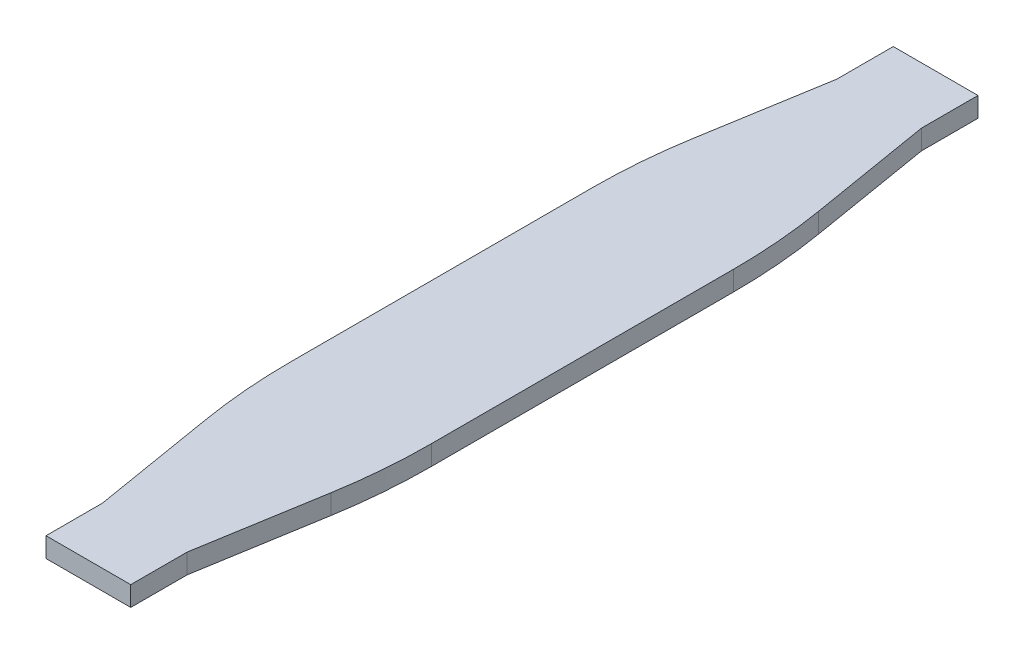
ISO-10303-21;
HEADER;
FILE_DESCRIPTION(('STEP AP214'),'2;1');
FILE_NAME('part.step','',(''),(''),'','','');
FILE_SCHEMA(('AUTOMOTIVE_DESIGN { 1 0 10303 214 1 1 1 1 }'));
ENDSEC;
DATA;
#1=APPLICATION_CONTEXT('core data for automotive mechanical design processes');
#2=APPLICATION_PROTOCOL_DEFINITION('international standard','automotive_design',2000,#1);
#3=PRODUCT_CONTEXT('',#1,'mechanical');
#4=PRODUCT('Part','Part','',(#3));
#5=PRODUCT_RELATED_PRODUCT_CATEGORY('part','',(#4));
#6=PRODUCT_DEFINITION_FORMATION('','',#4);
#7=PRODUCT_DEFINITION_CONTEXT('part definition',#1,'design');
#8=PRODUCT_DEFINITION('design','',#6,#7);
#9=PRODUCT_DEFINITION_SHAPE('','',#8);
#10=(LENGTH_UNIT() NAMED_UNIT(*) SI_UNIT(.MILLI.,.METRE.));
#11=(NAMED_UNIT(*) PLANE_ANGLE_UNIT() SI_UNIT($,.RADIAN.));
#12=(NAMED_UNIT(*) SI_UNIT($,.STERADIAN.) SOLID_ANGLE_UNIT());
#13=UNCERTAINTY_MEASURE_WITH_UNIT(LENGTH_MEASURE(1.E-05),#10,'distance_accuracy_value','');
#14=(GEOMETRIC_REPRESENTATION_CONTEXT(3) GLOBAL_UNCERTAINTY_ASSIGNED_CONTEXT((#13)) GLOBAL_UNIT_ASSIGNED_CONTEXT((#10,
#11,#12)) REPRESENTATION_CONTEXT('',''));
#15=CARTESIAN_POINT('',(0.,0.,0.));
#16=DIRECTION('',(0.,0.,1.));
#17=DIRECTION('',(1.,0.,0.));
#18=AXIS2_PLACEMENT_3D('',#15,#16,#17);
#19=CARTESIAN_POINT('',(66.4571890003025,0.35,-139.493591924394));
#20=DIRECTION('',(-1.,0.,0.));
#21=DIRECTION('',(0.,0.,1.));
#22=AXIS2_PLACEMENT_3D('',#19,#20,#21);
#23=PLANE('',#22);
#24=DIRECTION('',(0.,0.,-1.));
#25=VECTOR('',#24,1.);
#26=CARTESIAN_POINT('',(66.4571890003025,0.,-139.493591924394));
#27=LINE('',#26,#25);
#28=CARTESIAN_POINT('',(66.4571890003025,0.,-133.321217227377));
#29=VERTEX_POINT('',#28);
#30=CARTESIAN_POINT('',(66.4571890003025,0.,-138.665966621412));
#31=VERTEX_POINT('',#30);
#32=EDGE_CURVE('E229',#29,#31,#27,.T.);
#33=ORIENTED_EDGE('',*,*,#32,.T.);
#34=DIRECTION('',(0.,-1.,0.));
#35=VECTOR('',#34,1.);
#36=CARTESIAN_POINT('',(66.4571890003025,0.35,-138.665966621412));
#37=LINE('',#36,#35);
#38=CARTESIAN_POINT('',(66.4571890003025,0.35,-138.665966621412));
#39=VERTEX_POINT('',#38);
#40=EDGE_CURVE('E305',#31,#39,#37,.F.);
#41=ORIENTED_EDGE('',*,*,#40,.T.);
#42=DIRECTION('',(0.,0.,-1.));
#43=VECTOR('',#42,1.);
#44=CARTESIAN_POINT('',(66.4571890003025,0.35,-139.493591924394));
#45=LINE('',#44,#43);
#46=CARTESIAN_POINT('',(66.4571890003025,0.35,-133.321217227377));
#47=VERTEX_POINT('',#46);
#48=EDGE_CURVE('E185',#47,#39,#45,.T.);
#49=ORIENTED_EDGE('',*,*,#48,.F.);
#50=DIRECTION('',(0.,-1.,0.));
#51=VECTOR('',#50,1.);
#52=CARTESIAN_POINT('',(66.4571890003025,0.35,-133.321217227377));
#53=LINE('',#52,#51);
#54=EDGE_CURVE('E301',#47,#29,#53,.T.);
#55=ORIENTED_EDGE('',*,*,#54,.T.);
#56=EDGE_LOOP('',(#33,#41,#49,#55));
#57=FACE_BOUND('',#56,.T.);
#58=ADVANCED_FACE('F38',(#57),#23,.F.);
#59=CARTESIAN_POINT('',(65.9571890003025,0.35,-142.493591924394));
#60=DIRECTION('',(-0.986393923832144,0.,0.164398987305357));
#61=DIRECTION('',(0.164398987305357,0.,0.986393923832144));
#62=AXIS2_PLACEMENT_3D('',#59,#60,#61);
#63=PLANE('',#62);
#64=DIRECTION('',(-0.164398987305357,0.,-0.986393923832144));
#65=VECTOR('',#64,1.);
#66=CARTESIAN_POINT('',(65.9571890003025,0.35,-142.493591924394));
#67=LINE('',#66,#65);
#68=CARTESIAN_POINT('',(66.321128238624,0.35,-140.309956494466));
#69=VERTEX_POINT('',#68);
#70=CARTESIAN_POINT('',(65.9571890003025,0.35,-142.493591924394));
#71=VERTEX_POINT('',#70);
#72=EDGE_CURVE('E172',#69,#71,#67,.T.);
#73=ORIENTED_EDGE('',*,*,#72,.F.);
#74=DIRECTION('',(0.,-1.,0.));
#75=VECTOR('',#74,1.);
#76=CARTESIAN_POINT('',(66.321128238624,0.35,-140.309956494466));
#77=LINE('',#76,#75);
#78=CARTESIAN_POINT('',(66.321128238624,0.,-140.309956494466));
#79=VERTEX_POINT('',#78);
#80=EDGE_CURVE('E195',#69,#79,#77,.T.);
#81=ORIENTED_EDGE('',*,*,#80,.T.);
#82=DIRECTION('',(-0.164398987305357,0.,-0.986393923832144));
#83=VECTOR('',#82,1.);
#84=CARTESIAN_POINT('',(65.9571890003025,0.,-142.493591924394));
#85=LINE('',#84,#83);
#86=CARTESIAN_POINT('',(65.9571890003025,0.,-142.493591924394));
#87=VERTEX_POINT('',#86);
#88=EDGE_CURVE('E191',#79,#87,#85,.T.);
#89=ORIENTED_EDGE('',*,*,#88,.T.);
#90=DIRECTION('',(0.,-1.,0.));
#91=VECTOR('',#90,1.);
#92=CARTESIAN_POINT('',(65.9571890003025,0.35,-142.493591924394));
#93=LINE('',#92,#91);
#94=EDGE_CURVE('E188',#71,#87,#93,.T.);
#95=ORIENTED_EDGE('',*,*,#94,.F.);
#96=EDGE_LOOP('',(#73,#81,#89,#95));
#97=FACE_BOUND('',#96,.T.);
#98=ADVANCED_FACE('F189',(#97),#63,.F.);
#99=CARTESIAN_POINT('',(65.9571890003025,0.35,-143.493591924394));
#100=DIRECTION('',(-1.,0.,0.));
#101=DIRECTION('',(0.,0.,1.));
#102=AXIS2_PLACEMENT_3D('',#99,#100,#101);
#103=PLANE('',#102);
#104=DIRECTION('',(0.,0.,-1.));
#105=VECTOR('',#104,1.);
#106=CARTESIAN_POINT('',(65.9571890003025,0.,-143.493591924394));
#107=LINE('',#106,#105);
#108=CARTESIAN_POINT('',(65.9571890003025,0.,-143.493591924394));
#109=VERTEX_POINT('',#108);
#110=EDGE_CURVE('E235',#87,#109,#107,.T.);
#111=ORIENTED_EDGE('',*,*,#110,.T.);
#112=DIRECTION('',(0.,-1.,0.));
#113=VECTOR('',#112,1.);
#114=CARTESIAN_POINT('',(65.9571890003025,0.35,-143.493591924394));
#115=LINE('',#114,#113);
#116=CARTESIAN_POINT('',(65.9571890003025,0.35,-143.493591924394));
#117=VERTEX_POINT('',#116);
#118=EDGE_CURVE('E196',#117,#109,#115,.T.);
#119=ORIENTED_EDGE('',*,*,#118,.F.);
#120=DIRECTION('',(0.,0.,-1.));
#121=VECTOR('',#120,1.);
#122=CARTESIAN_POINT('',(65.9571890003025,0.35,-143.493591924394));
#123=LINE('',#122,#121);
#124=EDGE_CURVE('E177',#71,#117,#123,.T.);
#125=ORIENTED_EDGE('',*,*,#124,.F.);
#126=ORIENTED_EDGE('',*,*,#94,.T.);
#127=EDGE_LOOP('',(#111,#119,#125,#126));
#128=FACE_BOUND('',#127,.T.);
#129=ADVANCED_FACE('F198',(#128),#103,.F.);
#130=CARTESIAN_POINT('',(64.4571890003025,0.35,-143.493591924394));
#131=DIRECTION('',(0.,0.,1.));
#132=DIRECTION('',(1.,0.,0.));
#133=AXIS2_PLACEMENT_3D('',#130,#131,#132);
#134=PLANE('',#133);
#135=DIRECTION('',(-1.,0.,0.));
#136=VECTOR('',#135,1.);
#137=CARTESIAN_POINT('',(64.4571890003025,0.,-143.493591924394));
#138=LINE('',#137,#136);
#139=CARTESIAN_POINT('',(64.4571890003025,0.,-143.493591924394));
#140=VERTEX_POINT('',#139);
#141=EDGE_CURVE('E238',#109,#140,#138,.T.);
#142=ORIENTED_EDGE('',*,*,#141,.T.);
#143=DIRECTION('',(0.,-1.,0.));
#144=VECTOR('',#143,1.);
#145=CARTESIAN_POINT('',(64.4571890003025,0.35,-143.493591924394));
#146=LINE('',#145,#144);
#147=CARTESIAN_POINT('',(64.4571890003025,0.35,-143.493591924394));
#148=VERTEX_POINT('',#147);
#149=EDGE_CURVE('E282',#148,#140,#146,.T.);
#150=ORIENTED_EDGE('',*,*,#149,.F.);
#151=DIRECTION('',(-1.,0.,0.));
#152=VECTOR('',#151,1.);
#153=CARTESIAN_POINT('',(64.4571890003025,0.35,-143.493591924394));
#154=LINE('',#153,#152);
#155=EDGE_CURVE('E202',#117,#148,#154,.T.);
#156=ORIENTED_EDGE('',*,*,#155,.F.);
#157=ORIENTED_EDGE('',*,*,#118,.T.);
#158=EDGE_LOOP('',(#142,#150,#156,#157));
#159=FACE_BOUND('',#158,.T.);
#160=ADVANCED_FACE('F404',(#159),#134,.F.);
#161=CARTESIAN_POINT('',(64.4571890003025,0.35,-142.493591924394));
#162=DIRECTION('',(1.,0.,0.));
#163=DIRECTION('',(0.,0.,-1.));
#164=AXIS2_PLACEMENT_3D('',#161,#162,#163);
#165=PLANE('',#164);
#166=DIRECTION('',(0.,0.,1.));
#167=VECTOR('',#166,1.);
#168=CARTESIAN_POINT('',(64.4571890003025,0.,-142.493591924394));
#169=LINE('',#168,#167);
#170=CARTESIAN_POINT('',(64.4571890003025,0.,-142.493591924394));
#171=VERTEX_POINT('',#170);
#172=EDGE_CURVE('E241',#140,#171,#169,.T.);
#173=ORIENTED_EDGE('',*,*,#172,.T.);
#174=DIRECTION('',(0.,-1.,0.));
#175=VECTOR('',#174,1.);
#176=CARTESIAN_POINT('',(64.4571890003025,0.35,-142.493591924394));
#177=LINE('',#176,#175);
#178=CARTESIAN_POINT('',(64.4571890003025,0.35,-142.493591924394));
#179=VERTEX_POINT('',#178);
#180=EDGE_CURVE('E278',#179,#171,#177,.T.);
#181=ORIENTED_EDGE('',*,*,#180,.F.);
#182=DIRECTION('',(0.,0.,1.));
#183=VECTOR('',#182,1.);
#184=CARTESIAN_POINT('',(64.4571890003025,0.35,-142.493591924394));
#185=LINE('',#184,#183);
#186=EDGE_CURVE('E206',#148,#179,#185,.T.);
#187=ORIENTED_EDGE('',*,*,#186,.F.);
#188=ORIENTED_EDGE('',*,*,#149,.T.);
#189=EDGE_LOOP('',(#173,#181,#187,#188));
#190=FACE_BOUND('',#189,.T.);
#191=ADVANCED_FACE('F400',(#190),#165,.F.);
#192=CARTESIAN_POINT('',(63.9571890003025,0.35,-139.493591924394));
#193=DIRECTION('',(0.986393923832144,0.,0.164398987305357));
#194=DIRECTION('',(0.164398987305357,0.,-0.986393923832144));
#195=AXIS2_PLACEMENT_3D('',#192,#193,#194);
#196=PLANE('',#195);
#197=DIRECTION('',(-0.164398987305357,0.,0.986393923832144));
#198=VECTOR('',#197,1.);
#199=CARTESIAN_POINT('',(63.9571890003025,0.,-139.493591924394));
#200=LINE('',#199,#198);
#201=CARTESIAN_POINT('',(64.0932497619811,0.,-140.309956494466));
#202=VERTEX_POINT('',#201);
#203=EDGE_CURVE('E244',#171,#202,#200,.T.);
#204=ORIENTED_EDGE('',*,*,#203,.T.);
#205=DIRECTION('',(0.,-1.,0.));
#206=VECTOR('',#205,1.);
#207=CARTESIAN_POINT('',(64.0932497619811,0.35,-140.309956494466));
#208=LINE('',#207,#206);
#209=CARTESIAN_POINT('',(64.0932497619811,0.35,-140.309956494466));
#210=VERTEX_POINT('',#209);
#211=EDGE_CURVE('E11',#202,#210,#208,.F.);
#212=ORIENTED_EDGE('',*,*,#211,.T.);
#213=DIRECTION('',(-0.164398987305357,0.,0.986393923832144));
#214=VECTOR('',#213,1.);
#215=CARTESIAN_POINT('',(63.9571890003025,0.35,-139.493591924394));
#216=LINE('',#215,#214);
#217=EDGE_CURVE('E212',#179,#210,#216,.T.);
#218=ORIENTED_EDGE('',*,*,#217,.F.);
#219=ORIENTED_EDGE('',*,*,#180,.T.);
#220=EDGE_LOOP('',(#204,#212,#218,#219));
#221=FACE_BOUND('',#220,.T.);
#222=ADVANCED_FACE('F395',(#221),#196,.F.);
#223=CARTESIAN_POINT('',(63.9571890003025,0.35,-132.493591924394));
#224=DIRECTION('',(1.,0.,0.));
#225=DIRECTION('',(0.,0.,-1.));
#226=AXIS2_PLACEMENT_3D('',#223,#224,#225);
#227=PLANE('',#226);
#228=DIRECTION('',(0.,0.,1.));
#229=VECTOR('',#228,1.);
#230=CARTESIAN_POINT('',(63.9571890003025,0.,-132.493591924394));
#231=LINE('',#230,#229);
#232=CARTESIAN_POINT('',(63.9571890003025,0.,-138.665966621412));
#233=VERTEX_POINT('',#232);
#234=CARTESIAN_POINT('',(63.9571890003025,0.,-133.321217227377));
#235=VERTEX_POINT('',#234);
#236=EDGE_CURVE('E248',#233,#235,#231,.T.);
#237=ORIENTED_EDGE('',*,*,#236,.T.);
#238=DIRECTION('',(0.,-1.,0.));
#239=VECTOR('',#238,1.);
#240=CARTESIAN_POINT('',(63.9571890003025,0.35,-133.321217227377));
#241=LINE('',#240,#239);
#242=CARTESIAN_POINT('',(63.9571890003025,0.35,-133.321217227377));
#243=VERTEX_POINT('',#242);
#244=EDGE_CURVE('E47',#235,#243,#241,.F.);
#245=ORIENTED_EDGE('',*,*,#244,.T.);
#246=DIRECTION('',(0.,0.,1.));
#247=VECTOR('',#246,1.);
#248=CARTESIAN_POINT('',(63.9571890003025,0.35,-132.493591924394));
#249=LINE('',#248,#247);
#250=CARTESIAN_POINT('',(63.9571890003025,0.35,-138.665966621412));
#251=VERTEX_POINT('',#250);
#252=EDGE_CURVE('E215',#251,#243,#249,.T.);
#253=ORIENTED_EDGE('',*,*,#252,.F.);
#254=DIRECTION('',(0.,-1.,0.));
#255=VECTOR('',#254,1.);
#256=CARTESIAN_POINT('',(63.9571890003025,0.35,-138.665966621412));
#257=LINE('',#256,#255);
#258=EDGE_CURVE('E322',#251,#233,#257,.T.);
#259=ORIENTED_EDGE('',*,*,#258,.T.);
#260=EDGE_LOOP('',(#237,#245,#253,#259));
#261=FACE_BOUND('',#260,.T.);
#262=ADVANCED_FACE('F329',(#261),#227,.F.);
#263=CARTESIAN_POINT('',(63.9571890003025,0.35,-132.493591924394));
#264=DIRECTION('',(0.986393923832144,0.,-0.164398987305357));
#265=DIRECTION('',(-0.164398987305357,0.,-0.986393923832144));
#266=AXIS2_PLACEMENT_3D('',#263,#264,#265);
#267=PLANE('',#266);
#268=DIRECTION('',(0.164398987305357,0.,0.986393923832144));
#269=VECTOR('',#268,1.);
#270=CARTESIAN_POINT('',(63.9571890003025,0.35,-132.493591924394));
#271=LINE('',#270,#269);
#272=CARTESIAN_POINT('',(64.0932497619811,0.35,-131.677227354323));
#273=VERTEX_POINT('',#272);
#274=CARTESIAN_POINT('',(64.4571890003025,0.35,-129.493591924394));
#275=VERTEX_POINT('',#274);
#276=EDGE_CURVE('E217',#273,#275,#271,.T.);
#277=ORIENTED_EDGE('',*,*,#276,.F.);
#278=DIRECTION('',(0.,-1.,0.));
#279=VECTOR('',#278,1.);
#280=CARTESIAN_POINT('',(64.0932497619811,0.35,-131.677227354323));
#281=LINE('',#280,#279);
#282=CARTESIAN_POINT('',(64.0932497619811,0.,-131.677227354323));
#283=VERTEX_POINT('',#282);
#284=EDGE_CURVE('E318',#273,#283,#281,.T.);
#285=ORIENTED_EDGE('',*,*,#284,.T.);
#286=DIRECTION('',(0.164398987305357,0.,0.986393923832144));
#287=VECTOR('',#286,1.);
#288=CARTESIAN_POINT('',(63.9571890003025,0.,-132.493591924394));
#289=LINE('',#288,#287);
#290=CARTESIAN_POINT('',(64.4571890003025,0.,-129.493591924394));
#291=VERTEX_POINT('',#290);
#292=EDGE_CURVE('E252',#283,#291,#289,.T.);
#293=ORIENTED_EDGE('',*,*,#292,.T.);
#294=DIRECTION('',(0.,-1.,0.));
#295=VECTOR('',#294,1.);
#296=CARTESIAN_POINT('',(64.4571890003025,0.35,-129.493591924394));
#297=LINE('',#296,#295);
#298=EDGE_CURVE('E274',#275,#291,#297,.T.);
#299=ORIENTED_EDGE('',*,*,#298,.F.);
#300=EDGE_LOOP('',(#277,#285,#293,#299));
#301=FACE_BOUND('',#300,.T.);
#302=ADVANCED_FACE('F338',(#301),#267,.F.);
#303=CARTESIAN_POINT('',(64.4571890003025,0.35,-129.493591924394));
#304=DIRECTION('',(1.,0.,0.));
#305=DIRECTION('',(0.,0.,-1.));
#306=AXIS2_PLACEMENT_3D('',#303,#304,#305);
#307=PLANE('',#306);
#308=DIRECTION('',(0.,0.,1.));
#309=VECTOR('',#308,1.);
#310=CARTESIAN_POINT('',(64.4571890003025,0.,-129.493591924394));
#311=LINE('',#310,#309);
#312=CARTESIAN_POINT('',(64.4571890003025,0.,-128.493591924394));
#313=VERTEX_POINT('',#312);
#314=EDGE_CURVE('E255',#291,#313,#311,.T.);
#315=ORIENTED_EDGE('',*,*,#314,.T.);
#316=DIRECTION('',(0.,-1.,0.));
#317=VECTOR('',#316,1.);
#318=CARTESIAN_POINT('',(64.4571890003025,0.35,-128.493591924394));
#319=LINE('',#318,#317);
#320=CARTESIAN_POINT('',(64.4571890003025,0.35,-128.493591924394));
#321=VERTEX_POINT('',#320);
#322=EDGE_CURVE('E271',#321,#313,#319,.T.);
#323=ORIENTED_EDGE('',*,*,#322,.F.);
#324=DIRECTION('',(0.,0.,1.));
#325=VECTOR('',#324,1.);
#326=CARTESIAN_POINT('',(64.4571890003025,0.35,-129.493591924394));
#327=LINE('',#326,#325);
#328=EDGE_CURVE('E219',#275,#321,#327,.T.);
#329=ORIENTED_EDGE('',*,*,#328,.F.);
#330=ORIENTED_EDGE('',*,*,#298,.T.);
#331=EDGE_LOOP('',(#315,#323,#329,#330));
#332=FACE_BOUND('',#331,.T.);
#333=ADVANCED_FACE('F346',(#332),#307,.F.);
#334=CARTESIAN_POINT('',(65.2071890003025,0.35,-128.493591924394));
#335=DIRECTION('',(0.,0.,-1.));
#336=DIRECTION('',(-1.,0.,0.));
#337=AXIS2_PLACEMENT_3D('',#334,#335,#336);
#338=PLANE('',#337);
#339=DIRECTION('',(1.,0.,0.));
#340=VECTOR('',#339,1.);
#341=CARTESIAN_POINT('',(65.2071890003025,0.,-128.493591924394));
#342=LINE('',#341,#340);
#343=CARTESIAN_POINT('',(65.9571890003025,0.,-128.493591924394));
#344=VERTEX_POINT('',#343);
#345=EDGE_CURVE('E259',#313,#344,#342,.T.);
#346=ORIENTED_EDGE('',*,*,#345,.T.);
#347=DIRECTION('',(0.,-1.,0.));
#348=VECTOR('',#347,1.);
#349=CARTESIAN_POINT('',(65.9571890003025,0.35,-128.493591924394));
#350=LINE('',#349,#348);
#351=CARTESIAN_POINT('',(65.9571890003025,0.35,-128.493591924394));
#352=VERTEX_POINT('',#351);
#353=EDGE_CURVE('E268',#352,#344,#350,.T.);
#354=ORIENTED_EDGE('',*,*,#353,.F.);
#355=DIRECTION('',(1.,0.,0.));
#356=VECTOR('',#355,1.);
#357=CARTESIAN_POINT('',(64.4571890003025,0.35,-128.493591924394));
#358=LINE('',#357,#356);
#359=EDGE_CURVE('E221',#321,#352,#358,.T.);
#360=ORIENTED_EDGE('',*,*,#359,.F.);
#361=ORIENTED_EDGE('',*,*,#322,.T.);
#362=EDGE_LOOP('',(#346,#354,#360,#361));
#363=FACE_BOUND('',#362,.T.);
#364=ADVANCED_FACE('F350',(#363),#338,.F.);
#365=CARTESIAN_POINT('',(65.9571890003025,0.35,-128.493591924394));
#366=DIRECTION('',(-1.,0.,0.));
#367=DIRECTION('',(0.,0.,1.));
#368=AXIS2_PLACEMENT_3D('',#365,#366,#367);
#369=PLANE('',#368);
#370=DIRECTION('',(0.,0.,-1.));
#371=VECTOR('',#370,1.);
#372=CARTESIAN_POINT('',(65.9571890003025,0.,-128.493591924394));
#373=LINE('',#372,#371);
#374=CARTESIAN_POINT('',(65.9571890003026,0.,-129.493591924394));
#375=VERTEX_POINT('',#374);
#376=EDGE_CURVE('E261',#344,#375,#373,.T.);
#377=ORIENTED_EDGE('',*,*,#376,.T.);
#378=DIRECTION('',(0.,-1.,0.));
#379=VECTOR('',#378,1.);
#380=CARTESIAN_POINT('',(65.9571890003026,0.35,-129.493591924394));
#381=LINE('',#380,#379);
#382=CARTESIAN_POINT('',(65.9571890003026,0.35,-129.493591924394));
#383=VERTEX_POINT('',#382);
#384=EDGE_CURVE('E228',#383,#375,#381,.T.);
#385=ORIENTED_EDGE('',*,*,#384,.F.);
#386=DIRECTION('',(0.,0.,-1.));
#387=VECTOR('',#386,1.);
#388=CARTESIAN_POINT('',(65.9571890003025,0.35,-128.493591924394));
#389=LINE('',#388,#387);
#390=EDGE_CURVE('E223',#352,#383,#389,.T.);
#391=ORIENTED_EDGE('',*,*,#390,.F.);
#392=ORIENTED_EDGE('',*,*,#353,.T.);
#393=EDGE_LOOP('',(#377,#385,#391,#392));
#394=FACE_BOUND('',#393,.T.);
#395=ADVANCED_FACE('F356',(#394),#369,.F.);
#396=CARTESIAN_POINT('',(65.9571890003026,0.35,-129.493591924394));
#397=DIRECTION('',(-0.986393923832144,0.,-0.164398987305353));
#398=DIRECTION('',(-0.164398987305353,0.,0.986393923832145));
#399=AXIS2_PLACEMENT_3D('',#396,#397,#398);
#400=PLANE('',#399);
#401=DIRECTION('',(0.164398987305353,0.,-0.986393923832145));
#402=VECTOR('',#401,1.);
#403=CARTESIAN_POINT('',(65.9571890003026,0.,-129.493591924394));
#404=LINE('',#403,#402);
#405=CARTESIAN_POINT('',(66.321128238624,0.,-131.677227354323));
#406=VERTEX_POINT('',#405);
#407=EDGE_CURVE('E263',#375,#406,#404,.T.);
#408=ORIENTED_EDGE('',*,*,#407,.T.);
#409=DIRECTION('',(0.,-1.,0.));
#410=VECTOR('',#409,1.);
#411=CARTESIAN_POINT('',(66.321128238624,0.35,-131.677227354323));
#412=LINE('',#411,#410);
#413=CARTESIAN_POINT('',(66.321128238624,0.35,-131.677227354323));
#414=VERTEX_POINT('',#413);
#415=EDGE_CURVE('E57',#406,#414,#412,.F.);
#416=ORIENTED_EDGE('',*,*,#415,.T.);
#417=DIRECTION('',(0.164398987305353,0.,-0.986393923832145));
#418=VECTOR('',#417,1.);
#419=CARTESIAN_POINT('',(65.9571890003026,0.35,-129.493591924394));
#420=LINE('',#419,#418);
#421=EDGE_CURVE('E225',#383,#414,#420,.T.);
#422=ORIENTED_EDGE('',*,*,#421,.F.);
#423=ORIENTED_EDGE('',*,*,#384,.T.);
#424=EDGE_LOOP('',(#408,#416,#422,#423));
#425=FACE_BOUND('',#424,.T.);
#426=ADVANCED_FACE('F358',(#425),#400,.F.);
#427=CARTESIAN_POINT('',(0.,0.35,0.));
#428=DIRECTION('',(0.,1.,0.));
#429=DIRECTION('',(0.,0.,1.));
#430=AXIS2_PLACEMENT_3D('',#427,#428,#429);
#431=PLANE('',#430);
#432=ORIENTED_EDGE('',*,*,#48,.T.);
#433=CARTESIAN_POINT('',(56.4571890003025,0.35,-138.665966621412));
#434=DIRECTION('',(0.,1.,0.));
#435=DIRECTION('',(0.,0.,1.));
#436=AXIS2_PLACEMENT_3D('',#433,#434,#435);
#437=CIRCLE('',#436,10.);
#438=EDGE_CURVE('E180',#39,#69,#437,.T.);
#439=ORIENTED_EDGE('',*,*,#438,.T.);
#440=ORIENTED_EDGE('',*,*,#72,.T.);
#441=ORIENTED_EDGE('',*,*,#124,.T.);
#442=ORIENTED_EDGE('',*,*,#155,.T.);
#443=ORIENTED_EDGE('',*,*,#186,.T.);
#444=ORIENTED_EDGE('',*,*,#217,.T.);
#445=CARTESIAN_POINT('',(73.9571890003025,0.35,-138.665966621412));
#446=DIRECTION('',(0.,1.,0.));
#447=DIRECTION('',(0.,0.,1.));
#448=AXIS2_PLACEMENT_3D('',#445,#446,#447);
#449=CIRCLE('',#448,10.);
#450=EDGE_CURVE('E308',#210,#251,#449,.T.);
#451=ORIENTED_EDGE('',*,*,#450,.T.);
#452=ORIENTED_EDGE('',*,*,#252,.T.);
#453=CARTESIAN_POINT('',(73.9571890003025,0.35,-133.321217227377));
#454=DIRECTION('',(0.,1.,0.));
#455=DIRECTION('',(0.,0.,1.));
#456=AXIS2_PLACEMENT_3D('',#453,#454,#455);
#457=CIRCLE('',#456,10.);
#458=EDGE_CURVE('E65',#243,#273,#457,.T.);
#459=ORIENTED_EDGE('',*,*,#458,.T.);
#460=ORIENTED_EDGE('',*,*,#276,.T.);
#461=ORIENTED_EDGE('',*,*,#328,.T.);
#462=ORIENTED_EDGE('',*,*,#359,.T.);
#463=ORIENTED_EDGE('',*,*,#390,.T.);
#464=ORIENTED_EDGE('',*,*,#421,.T.);
#465=CARTESIAN_POINT('',(56.4571890003025,0.35,-133.321217227377));
#466=DIRECTION('',(0.,1.,0.));
#467=DIRECTION('',(0.,0.,1.));
#468=AXIS2_PLACEMENT_3D('',#465,#466,#467);
#469=CIRCLE('',#468,10.);
#470=EDGE_CURVE('E311',#414,#47,#469,.T.);
#471=ORIENTED_EDGE('',*,*,#470,.T.);
#472=EDGE_LOOP('',(#432,#439,#440,#441,#442,#443,#444,#451,#452,#459,#460,#461,#462,#463,#464,#471));
#473=FACE_BOUND('',#472,.T.);
#474=ADVANCED_FACE('F175',(#473),#431,.T.);
#475=CARTESIAN_POINT('',(0.,0.,0.));
#476=DIRECTION('',(0.,1.,0.));
#477=DIRECTION('',(0.,0.,1.));
#478=AXIS2_PLACEMENT_3D('',#475,#476,#477);
#479=PLANE('',#478);
#480=ORIENTED_EDGE('',*,*,#88,.F.);
#481=CARTESIAN_POINT('',(56.4571890003025,0.,-138.665966621412));
#482=DIRECTION('',(0.,1.,0.));
#483=DIRECTION('',(0.,0.,1.));
#484=AXIS2_PLACEMENT_3D('',#481,#482,#483);
#485=CIRCLE('',#484,10.);
#486=EDGE_CURVE('E298',#79,#31,#485,.F.);
#487=ORIENTED_EDGE('',*,*,#486,.T.);
#488=ORIENTED_EDGE('',*,*,#32,.F.);
#489=CARTESIAN_POINT('',(56.4571890003025,0.,-133.321217227377));
#490=DIRECTION('',(0.,1.,0.));
#491=DIRECTION('',(0.,0.,1.));
#492=AXIS2_PLACEMENT_3D('',#489,#490,#491);
#493=CIRCLE('',#492,10.);
#494=EDGE_CURVE('E295',#29,#406,#493,.F.);
#495=ORIENTED_EDGE('',*,*,#494,.T.);
#496=ORIENTED_EDGE('',*,*,#407,.F.);
#497=ORIENTED_EDGE('',*,*,#376,.F.);
#498=ORIENTED_EDGE('',*,*,#345,.F.);
#499=ORIENTED_EDGE('',*,*,#314,.F.);
#500=ORIENTED_EDGE('',*,*,#292,.F.);
#501=CARTESIAN_POINT('',(73.9571890003025,0.,-133.321217227377));
#502=DIRECTION('',(0.,1.,0.));
#503=DIRECTION('',(0.,0.,1.));
#504=AXIS2_PLACEMENT_3D('',#501,#502,#503);
#505=CIRCLE('',#504,10.);
#506=EDGE_CURVE('E292',#283,#235,#505,.F.);
#507=ORIENTED_EDGE('',*,*,#506,.T.);
#508=ORIENTED_EDGE('',*,*,#236,.F.);
#509=CARTESIAN_POINT('',(73.9571890003025,0.,-138.665966621412));
#510=DIRECTION('',(0.,1.,0.));
#511=DIRECTION('',(0.,0.,1.));
#512=AXIS2_PLACEMENT_3D('',#509,#510,#511);
#513=CIRCLE('',#512,10.);
#514=EDGE_CURVE('E289',#233,#202,#513,.F.);
#515=ORIENTED_EDGE('',*,*,#514,.T.);
#516=ORIENTED_EDGE('',*,*,#203,.F.);
#517=ORIENTED_EDGE('',*,*,#172,.F.);
#518=ORIENTED_EDGE('',*,*,#141,.F.);
#519=ORIENTED_EDGE('',*,*,#110,.F.);
#520=EDGE_LOOP('',(#480,#487,#488,#495,#496,#497,#498,#499,#500,#507,#508,#515,#516,#517,#518,#519));
#521=FACE_BOUND('',#520,.T.);
#522=ADVANCED_FACE('F342',(#521),#479,.F.);
#523=CARTESIAN_POINT('',(56.4571890003025,0.35,-138.665966621412));
#524=DIRECTION('',(0.,-1.,0.));
#525=DIRECTION('',(0.,0.,-1.));
#526=AXIS2_PLACEMENT_3D('',#523,#524,#525);
#527=CYLINDRICAL_SURFACE('',#526,10.);
#528=ORIENTED_EDGE('',*,*,#438,.F.);
#529=ORIENTED_EDGE('',*,*,#40,.F.);
#530=ORIENTED_EDGE('',*,*,#486,.F.);
#531=ORIENTED_EDGE('',*,*,#80,.F.);
#532=EDGE_LOOP('',(#528,#529,#530,#531));
#533=FACE_BOUND('',#532,.T.);
#534=ADVANCED_FACE('F377',(#533),#527,.T.);
#535=CARTESIAN_POINT('',(56.4571890003025,0.35,-133.321217227377));
#536=DIRECTION('',(0.,-1.,0.));
#537=DIRECTION('',(0.,0.,-1.));
#538=AXIS2_PLACEMENT_3D('',#535,#536,#537);
#539=CYLINDRICAL_SURFACE('',#538,10.);
#540=ORIENTED_EDGE('',*,*,#470,.F.);
#541=ORIENTED_EDGE('',*,*,#415,.F.);
#542=ORIENTED_EDGE('',*,*,#494,.F.);
#543=ORIENTED_EDGE('',*,*,#54,.F.);
#544=EDGE_LOOP('',(#540,#541,#542,#543));
#545=FACE_BOUND('',#544,.T.);
#546=ADVANCED_FACE('F380',(#545),#539,.T.);
#547=CARTESIAN_POINT('',(73.9571890003025,0.35,-133.321217227377));
#548=DIRECTION('',(0.,-1.,0.));
#549=DIRECTION('',(0.,0.,-1.));
#550=AXIS2_PLACEMENT_3D('',#547,#548,#549);
#551=CYLINDRICAL_SURFACE('',#550,10.);
#552=ORIENTED_EDGE('',*,*,#458,.F.);
#553=ORIENTED_EDGE('',*,*,#244,.F.);
#554=ORIENTED_EDGE('',*,*,#506,.F.);
#555=ORIENTED_EDGE('',*,*,#284,.F.);
#556=EDGE_LOOP('',(#552,#553,#554,#555));
#557=FACE_BOUND('',#556,.T.);
#558=ADVANCED_FACE('F335',(#557),#551,.T.);
#559=CARTESIAN_POINT('',(73.9571890003025,0.35,-138.665966621412));
#560=DIRECTION('',(0.,-1.,0.));
#561=DIRECTION('',(0.,0.,-1.));
#562=AXIS2_PLACEMENT_3D('',#559,#560,#561);
#563=CYLINDRICAL_SURFACE('',#562,10.);
#564=ORIENTED_EDGE('',*,*,#450,.F.);
#565=ORIENTED_EDGE('',*,*,#211,.F.);
#566=ORIENTED_EDGE('',*,*,#514,.F.);
#567=ORIENTED_EDGE('',*,*,#258,.F.);
#568=EDGE_LOOP('',(#564,#565,#566,#567));
#569=FACE_BOUND('',#568,.T.);
#570=ADVANCED_FACE('F40',(#569),#563,.T.);
#571=CLOSED_SHELL('',(#58,#98,#129,#160,#191,#222,#262,#302,#333,#364,#395,#426,#474,#522,#534,
#546,#558,#570));
#572=MANIFOLD_SOLID_BREP('B2',#571);
#573=ADVANCED_BREP_SHAPE_REPRESENTATION('',(#18,#572),#14);
#574=SHAPE_DEFINITION_REPRESENTATION(#9,#573);
ENDSEC;
END-ISO-10303-21;
